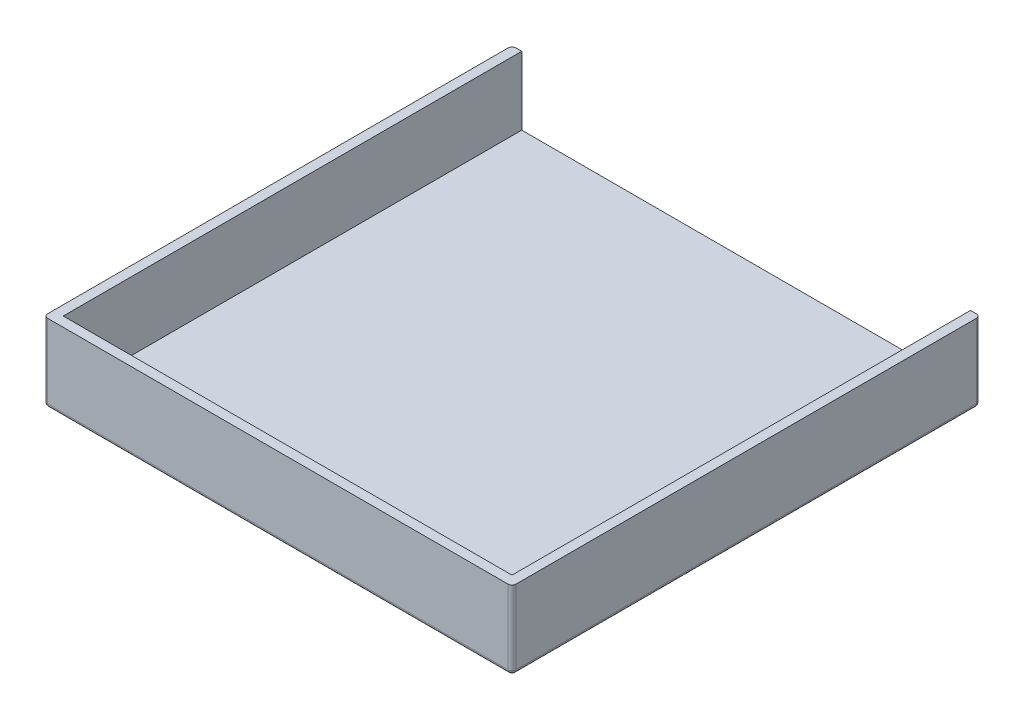
ISO-10303-21;
HEADER;
FILE_DESCRIPTION(('STEP AP214'),'2;1');
FILE_NAME('part.step','',(''),(''),'','','');
FILE_SCHEMA(('AUTOMOTIVE_DESIGN { 1 0 10303 214 1 1 1 1 }'));
ENDSEC;
DATA;
#1=APPLICATION_CONTEXT('core data for automotive mechanical design processes');
#2=APPLICATION_PROTOCOL_DEFINITION('international standard','automotive_design',2000,#1);
#3=PRODUCT_CONTEXT('',#1,'mechanical');
#4=PRODUCT('Part','Part','',(#3));
#5=PRODUCT_RELATED_PRODUCT_CATEGORY('part','',(#4));
#6=PRODUCT_DEFINITION_FORMATION('','',#4);
#7=PRODUCT_DEFINITION_CONTEXT('part definition',#1,'design');
#8=PRODUCT_DEFINITION('design','',#6,#7);
#9=PRODUCT_DEFINITION_SHAPE('','',#8);
#10=(LENGTH_UNIT() NAMED_UNIT(*) SI_UNIT(.MILLI.,.METRE.));
#11=(NAMED_UNIT(*) PLANE_ANGLE_UNIT() SI_UNIT($,.RADIAN.));
#12=(NAMED_UNIT(*) SI_UNIT($,.STERADIAN.) SOLID_ANGLE_UNIT());
#13=UNCERTAINTY_MEASURE_WITH_UNIT(LENGTH_MEASURE(1.E-05),#10,'distance_accuracy_value','');
#14=(GEOMETRIC_REPRESENTATION_CONTEXT(3) GLOBAL_UNCERTAINTY_ASSIGNED_CONTEXT((#13)) GLOBAL_UNIT_ASSIGNED_CONTEXT((#10,
#11,#12)) REPRESENTATION_CONTEXT('',''));
#15=CARTESIAN_POINT('',(0.,0.,0.));
#16=DIRECTION('',(0.,0.,1.));
#17=DIRECTION('',(1.,0.,0.));
#18=AXIS2_PLACEMENT_3D('',#15,#16,#17);
#19=CARTESIAN_POINT('',(0.,50.8,0.));
#20=DIRECTION('',(0.,-1.,0.));
#21=DIRECTION('',(0.,0.,-1.));
#22=AXIS2_PLACEMENT_3D('',#19,#20,#21);
#23=PLANE('',#22);
#24=DIRECTION('',(0.,0.,1.));
#25=VECTOR('',#24,1.);
#26=CARTESIAN_POINT('',(0.,50.8,0.));
#27=LINE('',#26,#25);
#28=CARTESIAN_POINT('',(0.,50.8,-302.26));
#29=VERTEX_POINT('',#28);
#30=CARTESIAN_POINT('',(0.,50.8,-2.54));
#31=VERTEX_POINT('',#30);
#32=EDGE_CURVE('E173',#29,#31,#27,.T.);
#33=ORIENTED_EDGE('',*,*,#32,.T.);
#34=CARTESIAN_POINT('',(2.54,50.8,-2.54));
#35=DIRECTION('',(0.,-1.,0.));
#36=DIRECTION('',(0.,0.,-1.));
#37=AXIS2_PLACEMENT_3D('',#34,#35,#36);
#38=CIRCLE('',#37,2.54);
#39=CARTESIAN_POINT('',(2.54,50.8,0.));
#40=VERTEX_POINT('',#39);
#41=EDGE_CURVE('E11',#31,#40,#38,.F.);
#42=ORIENTED_EDGE('',*,*,#41,.T.);
#43=DIRECTION('',(1.,0.,0.));
#44=VECTOR('',#43,1.);
#45=CARTESIAN_POINT('',(0.,50.8,0.));
#46=LINE('',#45,#44);
#47=CARTESIAN_POINT('',(302.26,50.8,0.));
#48=VERTEX_POINT('',#47);
#49=EDGE_CURVE('E176',#40,#48,#46,.T.);
#50=ORIENTED_EDGE('',*,*,#49,.T.);
#51=CARTESIAN_POINT('',(302.26,50.8,-2.54));
#52=DIRECTION('',(0.,-1.,0.));
#53=DIRECTION('',(0.,0.,-1.));
#54=AXIS2_PLACEMENT_3D('',#51,#52,#53);
#55=CIRCLE('',#54,2.54);
#56=CARTESIAN_POINT('',(304.8,50.8,-2.54));
#57=VERTEX_POINT('',#56);
#58=EDGE_CURVE('E42',#48,#57,#55,.F.);
#59=ORIENTED_EDGE('',*,*,#58,.T.);
#60=DIRECTION('',(0.,0.,-1.));
#61=VECTOR('',#60,1.);
#62=CARTESIAN_POINT('',(304.8,50.8,0.));
#63=LINE('',#62,#61);
#64=CARTESIAN_POINT('',(304.8,50.8,-302.26));
#65=VERTEX_POINT('',#64);
#66=EDGE_CURVE('E179',#57,#65,#63,.T.);
#67=ORIENTED_EDGE('',*,*,#66,.T.);
#68=CARTESIAN_POINT('',(302.26,50.8,-302.26));
#69=DIRECTION('',(0.,-1.,0.));
#70=DIRECTION('',(0.,0.,-1.));
#71=AXIS2_PLACEMENT_3D('',#68,#69,#70);
#72=CIRCLE('',#71,2.54);
#73=CARTESIAN_POINT('',(302.26,50.8,-304.8));
#74=VERTEX_POINT('',#73);
#75=EDGE_CURVE('E217',#65,#74,#72,.F.);
#76=ORIENTED_EDGE('',*,*,#75,.T.);
#77=DIRECTION('',(-1.,0.,0.));
#78=VECTOR('',#77,1.);
#79=CARTESIAN_POINT('',(0.,50.8,-304.8));
#80=LINE('',#79,#78);
#81=CARTESIAN_POINT('',(298.45,50.8,-304.8));
#82=VERTEX_POINT('',#81);
#83=EDGE_CURVE('E183',#74,#82,#80,.T.);
#84=ORIENTED_EDGE('',*,*,#83,.T.);
#85=DIRECTION('',(0.,0.,-1.));
#86=VECTOR('',#85,1.);
#87=CARTESIAN_POINT('',(298.45,50.8,0.));
#88=LINE('',#87,#86);
#89=CARTESIAN_POINT('',(298.45,50.8,-6.35));
#90=VERTEX_POINT('',#89);
#91=EDGE_CURVE('E167',#90,#82,#88,.T.);
#92=ORIENTED_EDGE('',*,*,#91,.F.);
#93=DIRECTION('',(1.,0.,0.));
#94=VECTOR('',#93,1.);
#95=CARTESIAN_POINT('',(0.,50.8,-6.35));
#96=LINE('',#95,#94);
#97=CARTESIAN_POINT('',(6.35,50.8,-6.35));
#98=VERTEX_POINT('',#97);
#99=EDGE_CURVE('E150',#98,#90,#96,.T.);
#100=ORIENTED_EDGE('',*,*,#99,.F.);
#101=DIRECTION('',(0.,0.,1.));
#102=VECTOR('',#101,1.);
#103=CARTESIAN_POINT('',(6.35,50.8,0.));
#104=LINE('',#103,#102);
#105=CARTESIAN_POINT('',(6.35,50.8,-304.8));
#106=VERTEX_POINT('',#105);
#107=EDGE_CURVE('E162',#106,#98,#104,.T.);
#108=ORIENTED_EDGE('',*,*,#107,.F.);
#109=CARTESIAN_POINT('',(2.54,50.8,-304.8));
#110=VERTEX_POINT('',#109);
#111=EDGE_CURVE('E182',#106,#110,#80,.T.);
#112=ORIENTED_EDGE('',*,*,#111,.T.);
#113=CARTESIAN_POINT('',(2.54,50.8,-302.26));
#114=DIRECTION('',(0.,-1.,0.));
#115=DIRECTION('',(0.,0.,-1.));
#116=AXIS2_PLACEMENT_3D('',#113,#114,#115);
#117=CIRCLE('',#116,2.54);
#118=EDGE_CURVE('E219',#110,#29,#117,.F.);
#119=ORIENTED_EDGE('',*,*,#118,.T.);
#120=EDGE_LOOP('',(#33,#42,#50,#59,#67,#76,#84,#92,#100,#108,#112,#119));
#121=FACE_BOUND('',#120,.T.);
#122=ADVANCED_FACE('F33',(#121),#23,.F.);
#123=CARTESIAN_POINT('',(0.,50.8,0.));
#124=DIRECTION('',(1.,0.,0.));
#125=DIRECTION('',(0.,0.,-1.));
#126=AXIS2_PLACEMENT_3D('',#123,#124,#125);
#127=PLANE('',#126);
#128=DIRECTION('',(0.,0.,1.));
#129=VECTOR('',#128,1.);
#130=CARTESIAN_POINT('',(0.,2.54,0.));
#131=LINE('',#130,#129);
#132=CARTESIAN_POINT('',(0.,2.54,-302.26));
#133=VERTEX_POINT('',#132);
#134=CARTESIAN_POINT('',(0.,2.54,-2.54));
#135=VERTEX_POINT('',#134);
#136=EDGE_CURVE('E50',#133,#135,#131,.T.);
#137=ORIENTED_EDGE('',*,*,#136,.T.);
#138=DIRECTION('',(0.,-1.,0.));
#139=VECTOR('',#138,1.);
#140=CARTESIAN_POINT('',(0.,50.8,-2.54));
#141=LINE('',#140,#139);
#142=EDGE_CURVE('E215',#135,#31,#141,.F.);
#143=ORIENTED_EDGE('',*,*,#142,.T.);
#144=ORIENTED_EDGE('',*,*,#32,.F.);
#145=DIRECTION('',(0.,-1.,0.));
#146=VECTOR('',#145,1.);
#147=CARTESIAN_POINT('',(0.,50.8,-302.26));
#148=LINE('',#147,#146);
#149=EDGE_CURVE('E55',#29,#133,#148,.T.);
#150=ORIENTED_EDGE('',*,*,#149,.T.);
#151=EDGE_LOOP('',(#137,#143,#144,#150));
#152=FACE_BOUND('',#151,.T.);
#153=ADVANCED_FACE('F284',(#152),#127,.F.);
#154=CARTESIAN_POINT('',(0.,50.8,0.));
#155=DIRECTION('',(0.,0.,-1.));
#156=DIRECTION('',(-1.,0.,0.));
#157=AXIS2_PLACEMENT_3D('',#154,#155,#156);
#158=PLANE('',#157);
#159=ORIENTED_EDGE('',*,*,#49,.F.);
#160=DIRECTION('',(0.,-1.,0.));
#161=VECTOR('',#160,1.);
#162=CARTESIAN_POINT('',(2.54,50.8,0.));
#163=LINE('',#162,#161);
#164=CARTESIAN_POINT('',(2.54,2.54,0.));
#165=VERTEX_POINT('',#164);
#166=EDGE_CURVE('E190',#40,#165,#163,.T.);
#167=ORIENTED_EDGE('',*,*,#166,.T.);
#168=DIRECTION('',(1.,0.,0.));
#169=VECTOR('',#168,1.);
#170=CARTESIAN_POINT('',(304.8,2.54,0.));
#171=LINE('',#170,#169);
#172=CARTESIAN_POINT('',(302.26,2.54,0.));
#173=VERTEX_POINT('',#172);
#174=EDGE_CURVE('E187',#165,#173,#171,.T.);
#175=ORIENTED_EDGE('',*,*,#174,.T.);
#176=DIRECTION('',(0.,-1.,0.));
#177=VECTOR('',#176,1.);
#178=CARTESIAN_POINT('',(302.26,50.8,0.));
#179=LINE('',#178,#177);
#180=EDGE_CURVE('E185',#173,#48,#179,.F.);
#181=ORIENTED_EDGE('',*,*,#180,.T.);
#182=EDGE_LOOP('',(#159,#167,#175,#181));
#183=FACE_BOUND('',#182,.T.);
#184=ADVANCED_FACE('F288',(#183),#158,.F.);
#185=CARTESIAN_POINT('',(304.8,50.8,0.));
#186=DIRECTION('',(-1.,0.,0.));
#187=DIRECTION('',(0.,0.,1.));
#188=AXIS2_PLACEMENT_3D('',#185,#186,#187);
#189=PLANE('',#188);
#190=ORIENTED_EDGE('',*,*,#66,.F.);
#191=DIRECTION('',(0.,-1.,0.));
#192=VECTOR('',#191,1.);
#193=CARTESIAN_POINT('',(304.8,50.8,-2.54));
#194=LINE('',#193,#192);
#195=CARTESIAN_POINT('',(304.8,2.54,-2.54));
#196=VERTEX_POINT('',#195);
#197=EDGE_CURVE('E205',#57,#196,#194,.T.);
#198=ORIENTED_EDGE('',*,*,#197,.T.);
#199=DIRECTION('',(0.,0.,-1.));
#200=VECTOR('',#199,1.);
#201=CARTESIAN_POINT('',(304.8,2.54,-304.8));
#202=LINE('',#201,#200);
#203=CARTESIAN_POINT('',(304.8,2.54,-302.26));
#204=VERTEX_POINT('',#203);
#205=EDGE_CURVE('E203',#196,#204,#202,.T.);
#206=ORIENTED_EDGE('',*,*,#205,.T.);
#207=DIRECTION('',(0.,-1.,0.));
#208=VECTOR('',#207,1.);
#209=CARTESIAN_POINT('',(304.8,50.8,-302.26));
#210=LINE('',#209,#208);
#211=EDGE_CURVE('E201',#204,#65,#210,.F.);
#212=ORIENTED_EDGE('',*,*,#211,.T.);
#213=EDGE_LOOP('',(#190,#198,#206,#212));
#214=FACE_BOUND('',#213,.T.);
#215=ADVANCED_FACE('F297',(#214),#189,.F.);
#216=CARTESIAN_POINT('',(0.,50.8,-304.8));
#217=DIRECTION('',(0.,0.,1.));
#218=DIRECTION('',(1.,0.,0.));
#219=AXIS2_PLACEMENT_3D('',#216,#217,#218);
#220=PLANE('',#219);
#221=DIRECTION('',(-1.,0.,0.));
#222=VECTOR('',#221,1.);
#223=CARTESIAN_POINT('',(0.,2.54,-304.8));
#224=LINE('',#223,#222);
#225=CARTESIAN_POINT('',(302.26,2.54,-304.8));
#226=VERTEX_POINT('',#225);
#227=CARTESIAN_POINT('',(2.54,2.54,-304.8));
#228=VERTEX_POINT('',#227);
#229=EDGE_CURVE('E209',#226,#228,#224,.T.);
#230=ORIENTED_EDGE('',*,*,#229,.T.);
#231=DIRECTION('',(0.,-1.,0.));
#232=VECTOR('',#231,1.);
#233=CARTESIAN_POINT('',(2.54,50.8,-304.8));
#234=LINE('',#233,#232);
#235=EDGE_CURVE('E211',#228,#110,#234,.F.);
#236=ORIENTED_EDGE('',*,*,#235,.T.);
#237=ORIENTED_EDGE('',*,*,#111,.F.);
#238=DIRECTION('',(0.,-1.,0.));
#239=VECTOR('',#238,1.);
#240=CARTESIAN_POINT('',(6.35,50.8,-304.8));
#241=LINE('',#240,#239);
#242=CARTESIAN_POINT('',(6.35,6.35,-304.8));
#243=VERTEX_POINT('',#242);
#244=EDGE_CURVE('E169',#106,#243,#241,.T.);
#245=ORIENTED_EDGE('',*,*,#244,.T.);
#246=DIRECTION('',(-1.,0.,0.));
#247=VECTOR('',#246,1.);
#248=CARTESIAN_POINT('',(0.,6.35,-304.8));
#249=LINE('',#248,#247);
#250=CARTESIAN_POINT('',(298.45,6.35,-304.8));
#251=VERTEX_POINT('',#250);
#252=EDGE_CURVE('E160',#251,#243,#249,.T.);
#253=ORIENTED_EDGE('',*,*,#252,.F.);
#254=DIRECTION('',(0.,-1.,0.));
#255=VECTOR('',#254,1.);
#256=CARTESIAN_POINT('',(298.45,50.8,-304.8));
#257=LINE('',#256,#255);
#258=EDGE_CURVE('E155',#82,#251,#257,.T.);
#259=ORIENTED_EDGE('',*,*,#258,.F.);
#260=ORIENTED_EDGE('',*,*,#83,.F.);
#261=DIRECTION('',(0.,-1.,0.));
#262=VECTOR('',#261,1.);
#263=CARTESIAN_POINT('',(302.26,50.8,-304.8));
#264=LINE('',#263,#262);
#265=EDGE_CURVE('E207',#74,#226,#264,.T.);
#266=ORIENTED_EDGE('',*,*,#265,.T.);
#267=EDGE_LOOP('',(#230,#236,#237,#245,#253,#259,#260,#266));
#268=FACE_BOUND('',#267,.T.);
#269=ADVANCED_FACE('F265',(#268),#220,.F.);
#270=CARTESIAN_POINT('',(0.,0.,0.));
#271=DIRECTION('',(0.,-1.,0.));
#272=DIRECTION('',(0.,0.,-1.));
#273=AXIS2_PLACEMENT_3D('',#270,#271,#272);
#274=PLANE('',#273);
#275=DIRECTION('',(0.,0.,-1.));
#276=VECTOR('',#275,1.);
#277=CARTESIAN_POINT('',(302.26,0.,0.));
#278=LINE('',#277,#276);
#279=CARTESIAN_POINT('',(302.26,0.,-302.26));
#280=VERTEX_POINT('',#279);
#281=CARTESIAN_POINT('',(302.26,0.,-2.54));
#282=VERTEX_POINT('',#281);
#283=EDGE_CURVE('E196',#280,#282,#278,.F.);
#284=ORIENTED_EDGE('',*,*,#283,.T.);
#285=DIRECTION('',(1.,0.,0.));
#286=VECTOR('',#285,1.);
#287=CARTESIAN_POINT('',(0.,0.,-2.54));
#288=LINE('',#287,#286);
#289=CARTESIAN_POINT('',(2.54,0.,-2.54));
#290=VERTEX_POINT('',#289);
#291=EDGE_CURVE('E198',#282,#290,#288,.F.);
#292=ORIENTED_EDGE('',*,*,#291,.T.);
#293=DIRECTION('',(0.,0.,1.));
#294=VECTOR('',#293,1.);
#295=CARTESIAN_POINT('',(2.54,0.,-304.8));
#296=LINE('',#295,#294);
#297=CARTESIAN_POINT('',(2.54,0.,-302.26));
#298=VERTEX_POINT('',#297);
#299=EDGE_CURVE('E192',#290,#298,#296,.F.);
#300=ORIENTED_EDGE('',*,*,#299,.T.);
#301=DIRECTION('',(-1.,0.,0.));
#302=VECTOR('',#301,1.);
#303=CARTESIAN_POINT('',(304.8,0.,-302.26));
#304=LINE('',#303,#302);
#305=EDGE_CURVE('E194',#298,#280,#304,.F.);
#306=ORIENTED_EDGE('',*,*,#305,.T.);
#307=EDGE_LOOP('',(#284,#292,#300,#306));
#308=FACE_BOUND('',#307,.T.);
#309=ADVANCED_FACE('F313',(#308),#274,.T.);
#310=CARTESIAN_POINT('',(6.35,50.8,0.));
#311=DIRECTION('',(1.,0.,0.));
#312=DIRECTION('',(0.,0.,-1.));
#313=AXIS2_PLACEMENT_3D('',#310,#311,#312);
#314=PLANE('',#313);
#315=DIRECTION('',(0.,0.,1.));
#316=VECTOR('',#315,1.);
#317=CARTESIAN_POINT('',(6.35,6.35,0.));
#318=LINE('',#317,#316);
#319=CARTESIAN_POINT('',(6.35,6.35,-6.35));
#320=VERTEX_POINT('',#319);
#321=EDGE_CURVE('E141',#243,#320,#318,.T.);
#322=ORIENTED_EDGE('',*,*,#321,.F.);
#323=ORIENTED_EDGE('',*,*,#244,.F.);
#324=ORIENTED_EDGE('',*,*,#107,.T.);
#325=DIRECTION('',(0.,-1.,0.));
#326=VECTOR('',#325,1.);
#327=CARTESIAN_POINT('',(6.35,50.8,-6.35));
#328=LINE('',#327,#326);
#329=EDGE_CURVE('E154',#98,#320,#328,.T.);
#330=ORIENTED_EDGE('',*,*,#329,.T.);
#331=EDGE_LOOP('',(#322,#323,#324,#330));
#332=FACE_BOUND('',#331,.T.);
#333=ADVANCED_FACE('F258',(#332),#314,.T.);
#334=CARTESIAN_POINT('',(0.,50.8,-6.35));
#335=DIRECTION('',(0.,0.,-1.));
#336=DIRECTION('',(-1.,0.,0.));
#337=AXIS2_PLACEMENT_3D('',#334,#335,#336);
#338=PLANE('',#337);
#339=DIRECTION('',(1.,0.,0.));
#340=VECTOR('',#339,1.);
#341=CARTESIAN_POINT('',(0.,6.35,-6.35));
#342=LINE('',#341,#340);
#343=CARTESIAN_POINT('',(298.45,6.35,-6.35));
#344=VERTEX_POINT('',#343);
#345=EDGE_CURVE('E134',#320,#344,#342,.T.);
#346=ORIENTED_EDGE('',*,*,#345,.F.);
#347=ORIENTED_EDGE('',*,*,#329,.F.);
#348=ORIENTED_EDGE('',*,*,#99,.T.);
#349=DIRECTION('',(0.,-1.,0.));
#350=VECTOR('',#349,1.);
#351=CARTESIAN_POINT('',(298.45,50.8,-6.35));
#352=LINE('',#351,#350);
#353=EDGE_CURVE('E147',#90,#344,#352,.T.);
#354=ORIENTED_EDGE('',*,*,#353,.T.);
#355=EDGE_LOOP('',(#346,#347,#348,#354));
#356=FACE_BOUND('',#355,.T.);
#357=ADVANCED_FACE('F148',(#356),#338,.T.);
#358=CARTESIAN_POINT('',(298.45,50.8,0.));
#359=DIRECTION('',(-1.,0.,0.));
#360=DIRECTION('',(0.,0.,1.));
#361=AXIS2_PLACEMENT_3D('',#358,#359,#360);
#362=PLANE('',#361);
#363=DIRECTION('',(0.,0.,-1.));
#364=VECTOR('',#363,1.);
#365=CARTESIAN_POINT('',(298.45,6.35,0.));
#366=LINE('',#365,#364);
#367=EDGE_CURVE('E138',#344,#251,#366,.T.);
#368=ORIENTED_EDGE('',*,*,#367,.F.);
#369=ORIENTED_EDGE('',*,*,#353,.F.);
#370=ORIENTED_EDGE('',*,*,#91,.T.);
#371=ORIENTED_EDGE('',*,*,#258,.T.);
#372=EDGE_LOOP('',(#368,#369,#370,#371));
#373=FACE_BOUND('',#372,.T.);
#374=ADVANCED_FACE('F157',(#373),#362,.T.);
#375=CARTESIAN_POINT('',(0.,6.35,0.));
#376=DIRECTION('',(0.,-1.,0.));
#377=DIRECTION('',(0.,0.,-1.));
#378=AXIS2_PLACEMENT_3D('',#375,#376,#377);
#379=PLANE('',#378);
#380=ORIENTED_EDGE('',*,*,#321,.T.);
#381=ORIENTED_EDGE('',*,*,#345,.T.);
#382=ORIENTED_EDGE('',*,*,#367,.T.);
#383=ORIENTED_EDGE('',*,*,#252,.T.);
#384=EDGE_LOOP('',(#380,#381,#382,#383));
#385=FACE_BOUND('',#384,.T.);
#386=ADVANCED_FACE('F136',(#385),#379,.F.);
#387=CARTESIAN_POINT('',(2.54,50.8,-302.26));
#388=DIRECTION('',(0.,-1.,0.));
#389=DIRECTION('',(0.,0.,-1.));
#390=AXIS2_PLACEMENT_3D('',#387,#388,#389);
#391=CYLINDRICAL_SURFACE('',#390,2.54);
#392=ORIENTED_EDGE('',*,*,#118,.F.);
#393=ORIENTED_EDGE('',*,*,#235,.F.);
#394=CARTESIAN_POINT('',(2.54,2.54,-302.26));
#395=DIRECTION('',(0.,-1.,0.));
#396=DIRECTION('',(0.,0.,-1.));
#397=AXIS2_PLACEMENT_3D('',#394,#395,#396);
#398=CIRCLE('',#397,2.54);
#399=EDGE_CURVE('E249',#133,#228,#398,.T.);
#400=ORIENTED_EDGE('',*,*,#399,.F.);
#401=ORIENTED_EDGE('',*,*,#149,.F.);
#402=EDGE_LOOP('',(#392,#393,#400,#401));
#403=FACE_BOUND('',#402,.T.);
#404=ADVANCED_FACE('F35',(#403),#391,.T.);
#405=CARTESIAN_POINT('',(302.26,50.8,-302.26));
#406=DIRECTION('',(0.,-1.,0.));
#407=DIRECTION('',(0.,0.,-1.));
#408=AXIS2_PLACEMENT_3D('',#405,#406,#407);
#409=CYLINDRICAL_SURFACE('',#408,2.54);
#410=ORIENTED_EDGE('',*,*,#75,.F.);
#411=ORIENTED_EDGE('',*,*,#211,.F.);
#412=CARTESIAN_POINT('',(302.26,2.54,-302.26));
#413=DIRECTION('',(0.,-1.,0.));
#414=DIRECTION('',(0.,0.,-1.));
#415=AXIS2_PLACEMENT_3D('',#412,#413,#414);
#416=CIRCLE('',#415,2.54);
#417=EDGE_CURVE('E247',#226,#204,#416,.T.);
#418=ORIENTED_EDGE('',*,*,#417,.F.);
#419=ORIENTED_EDGE('',*,*,#265,.F.);
#420=EDGE_LOOP('',(#410,#411,#418,#419));
#421=FACE_BOUND('',#420,.T.);
#422=ADVANCED_FACE('F302',(#421),#409,.T.);
#423=CARTESIAN_POINT('',(0.,2.54,-302.26));
#424=DIRECTION('',(1.,0.,0.));
#425=DIRECTION('',(0.,0.,-1.));
#426=AXIS2_PLACEMENT_3D('',#423,#424,#425);
#427=CYLINDRICAL_SURFACE('',#426,2.54);
#428=CARTESIAN_POINT('',(2.54,2.54,-302.26));
#429=DIRECTION('',(-1.,0.,0.));
#430=DIRECTION('',(0.,0.,1.));
#431=AXIS2_PLACEMENT_3D('',#428,#429,#430);
#432=CIRCLE('',#431,2.54);
#433=EDGE_CURVE('E37',#228,#298,#432,.T.);
#434=ORIENTED_EDGE('',*,*,#433,.F.);
#435=ORIENTED_EDGE('',*,*,#229,.F.);
#436=CARTESIAN_POINT('',(302.26,2.54,-302.26));
#437=DIRECTION('',(1.,0.,0.));
#438=DIRECTION('',(0.,0.,-1.));
#439=AXIS2_PLACEMENT_3D('',#436,#437,#438);
#440=CIRCLE('',#439,2.54);
#441=EDGE_CURVE('E244',#280,#226,#440,.T.);
#442=ORIENTED_EDGE('',*,*,#441,.F.);
#443=ORIENTED_EDGE('',*,*,#305,.F.);
#444=EDGE_LOOP('',(#434,#435,#442,#443));
#445=FACE_BOUND('',#444,.T.);
#446=ADVANCED_FACE('F317',(#445),#427,.T.);
#447=CARTESIAN_POINT('',(2.54,2.54,-302.26));
#448=DIRECTION('',(0.,0.,1.));
#449=DIRECTION('',(1.,0.,0.));
#450=AXIS2_PLACEMENT_3D('',#447,#448,#449);
#451=SPHERICAL_SURFACE('',#450,2.54);
#452=ORIENTED_EDGE('',*,*,#399,.T.);
#453=ORIENTED_EDGE('',*,*,#433,.T.);
#454=CARTESIAN_POINT('',(2.54,2.54,-302.26));
#455=DIRECTION('',(0.,0.,-1.));
#456=DIRECTION('',(-1.,0.,0.));
#457=AXIS2_PLACEMENT_3D('',#454,#455,#456);
#458=CIRCLE('',#457,2.54);
#459=EDGE_CURVE('E241',#133,#298,#458,.F.);
#460=ORIENTED_EDGE('',*,*,#459,.F.);
#461=EDGE_LOOP('',(#452,#453,#460));
#462=FACE_BOUND('',#461,.T.);
#463=ADVANCED_FACE('F270',(#462),#451,.T.);
#464=CARTESIAN_POINT('',(302.26,2.54,-302.26));
#465=DIRECTION('',(0.,0.,1.));
#466=DIRECTION('',(1.,0.,0.));
#467=AXIS2_PLACEMENT_3D('',#464,#465,#466);
#468=SPHERICAL_SURFACE('',#467,2.54);
#469=ORIENTED_EDGE('',*,*,#441,.T.);
#470=ORIENTED_EDGE('',*,*,#417,.T.);
#471=CARTESIAN_POINT('',(302.26,2.54,-302.26));
#472=DIRECTION('',(0.,0.,-1.));
#473=DIRECTION('',(-1.,0.,0.));
#474=AXIS2_PLACEMENT_3D('',#471,#472,#473);
#475=CIRCLE('',#474,2.54);
#476=EDGE_CURVE('E238',#280,#204,#475,.F.);
#477=ORIENTED_EDGE('',*,*,#476,.F.);
#478=EDGE_LOOP('',(#469,#470,#477));
#479=FACE_BOUND('',#478,.T.);
#480=ADVANCED_FACE('F305',(#479),#468,.T.);
#481=CARTESIAN_POINT('',(2.54,2.54,0.));
#482=DIRECTION('',(0.,0.,-1.));
#483=DIRECTION('',(-1.,0.,0.));
#484=AXIS2_PLACEMENT_3D('',#481,#482,#483);
#485=CYLINDRICAL_SURFACE('',#484,2.54);
#486=ORIENTED_EDGE('',*,*,#459,.T.);
#487=ORIENTED_EDGE('',*,*,#299,.F.);
#488=CARTESIAN_POINT('',(2.54,2.54,-2.54));
#489=DIRECTION('',(0.,0.,1.));
#490=DIRECTION('',(1.,0.,0.));
#491=AXIS2_PLACEMENT_3D('',#488,#489,#490);
#492=CIRCLE('',#491,2.54);
#493=EDGE_CURVE('E235',#135,#290,#492,.T.);
#494=ORIENTED_EDGE('',*,*,#493,.F.);
#495=ORIENTED_EDGE('',*,*,#136,.F.);
#496=EDGE_LOOP('',(#486,#487,#494,#495));
#497=FACE_BOUND('',#496,.T.);
#498=ADVANCED_FACE('F274',(#497),#485,.T.);
#499=CARTESIAN_POINT('',(2.54,50.8,-2.54));
#500=DIRECTION('',(0.,-1.,0.));
#501=DIRECTION('',(0.,0.,-1.));
#502=AXIS2_PLACEMENT_3D('',#499,#500,#501);
#503=CYLINDRICAL_SURFACE('',#502,2.54);
#504=ORIENTED_EDGE('',*,*,#41,.F.);
#505=ORIENTED_EDGE('',*,*,#142,.F.);
#506=CARTESIAN_POINT('',(2.54,2.54,-2.54));
#507=DIRECTION('',(0.,-1.,0.));
#508=DIRECTION('',(0.,0.,-1.));
#509=AXIS2_PLACEMENT_3D('',#506,#507,#508);
#510=CIRCLE('',#509,2.54);
#511=EDGE_CURVE('E232',#165,#135,#510,.T.);
#512=ORIENTED_EDGE('',*,*,#511,.F.);
#513=ORIENTED_EDGE('',*,*,#166,.F.);
#514=EDGE_LOOP('',(#504,#505,#512,#513));
#515=FACE_BOUND('',#514,.T.);
#516=ADVANCED_FACE('F283',(#515),#503,.T.);
#517=CARTESIAN_POINT('',(302.26,50.8,-2.54));
#518=DIRECTION('',(0.,-1.,0.));
#519=DIRECTION('',(0.,0.,-1.));
#520=AXIS2_PLACEMENT_3D('',#517,#518,#519);
#521=CYLINDRICAL_SURFACE('',#520,2.54);
#522=ORIENTED_EDGE('',*,*,#58,.F.);
#523=ORIENTED_EDGE('',*,*,#180,.F.);
#524=CARTESIAN_POINT('',(302.26,2.54,-2.54));
#525=DIRECTION('',(0.,-1.,0.));
#526=DIRECTION('',(0.,0.,-1.));
#527=AXIS2_PLACEMENT_3D('',#524,#525,#526);
#528=CIRCLE('',#527,2.54);
#529=EDGE_CURVE('E229',#196,#173,#528,.T.);
#530=ORIENTED_EDGE('',*,*,#529,.F.);
#531=ORIENTED_EDGE('',*,*,#197,.F.);
#532=EDGE_LOOP('',(#522,#523,#530,#531));
#533=FACE_BOUND('',#532,.T.);
#534=ADVANCED_FACE('F292',(#533),#521,.T.);
#535=CARTESIAN_POINT('',(302.26,2.54,0.));
#536=DIRECTION('',(0.,0.,1.));
#537=DIRECTION('',(1.,0.,0.));
#538=AXIS2_PLACEMENT_3D('',#535,#536,#537);
#539=CYLINDRICAL_SURFACE('',#538,2.54);
#540=ORIENTED_EDGE('',*,*,#476,.T.);
#541=ORIENTED_EDGE('',*,*,#205,.F.);
#542=CARTESIAN_POINT('',(302.26,2.54,-2.54));
#543=DIRECTION('',(0.,0.,1.));
#544=DIRECTION('',(1.,0.,0.));
#545=AXIS2_PLACEMENT_3D('',#542,#543,#544);
#546=CIRCLE('',#545,2.54);
#547=EDGE_CURVE('E226',#282,#196,#546,.T.);
#548=ORIENTED_EDGE('',*,*,#547,.F.);
#549=ORIENTED_EDGE('',*,*,#283,.F.);
#550=EDGE_LOOP('',(#540,#541,#548,#549));
#551=FACE_BOUND('',#550,.T.);
#552=ADVANCED_FACE('F309',(#551),#539,.T.);
#553=CARTESIAN_POINT('',(2.54,2.54,-2.54));
#554=DIRECTION('',(0.,0.,1.));
#555=DIRECTION('',(1.,0.,0.));
#556=AXIS2_PLACEMENT_3D('',#553,#554,#555);
#557=SPHERICAL_SURFACE('',#556,2.54);
#558=ORIENTED_EDGE('',*,*,#511,.T.);
#559=ORIENTED_EDGE('',*,*,#493,.T.);
#560=CARTESIAN_POINT('',(2.54,2.54,-2.54));
#561=DIRECTION('',(-1.,0.,0.));
#562=DIRECTION('',(0.,0.,1.));
#563=AXIS2_PLACEMENT_3D('',#560,#561,#562);
#564=CIRCLE('',#563,2.54);
#565=EDGE_CURVE('E224',#165,#290,#564,.F.);
#566=ORIENTED_EDGE('',*,*,#565,.F.);
#567=EDGE_LOOP('',(#558,#559,#566));
#568=FACE_BOUND('',#567,.T.);
#569=ADVANCED_FACE('F278',(#568),#557,.T.);
#570=CARTESIAN_POINT('',(302.26,2.54,-2.54));
#571=DIRECTION('',(0.,0.,1.));
#572=DIRECTION('',(1.,0.,0.));
#573=AXIS2_PLACEMENT_3D('',#570,#571,#572);
#574=SPHERICAL_SURFACE('',#573,2.54);
#575=ORIENTED_EDGE('',*,*,#547,.T.);
#576=ORIENTED_EDGE('',*,*,#529,.T.);
#577=CARTESIAN_POINT('',(302.26,2.54,-2.54));
#578=DIRECTION('',(1.,0.,0.));
#579=DIRECTION('',(0.,0.,-1.));
#580=AXIS2_PLACEMENT_3D('',#577,#578,#579);
#581=CIRCLE('',#580,2.54);
#582=EDGE_CURVE('E222',#282,#173,#581,.F.);
#583=ORIENTED_EDGE('',*,*,#582,.F.);
#584=EDGE_LOOP('',(#575,#576,#583));
#585=FACE_BOUND('',#584,.T.);
#586=ADVANCED_FACE('F345',(#585),#574,.T.);
#587=CARTESIAN_POINT('',(0.,2.54,-2.54));
#588=DIRECTION('',(-1.,0.,0.));
#589=DIRECTION('',(0.,0.,1.));
#590=AXIS2_PLACEMENT_3D('',#587,#588,#589);
#591=CYLINDRICAL_SURFACE('',#590,2.54);
#592=ORIENTED_EDGE('',*,*,#565,.T.);
#593=ORIENTED_EDGE('',*,*,#291,.F.);
#594=ORIENTED_EDGE('',*,*,#582,.T.);
#595=ORIENTED_EDGE('',*,*,#174,.F.);
#596=EDGE_LOOP('',(#592,#593,#594,#595));
#597=FACE_BOUND('',#596,.T.);
#598=ADVANCED_FACE('F342',(#597),#591,.T.);
#599=CLOSED_SHELL('',(#122,#153,#184,#215,#269,#309,#333,#357,#374,#386,#404,#422,#446,#463,
#480,#498,#516,#534,#552,#569,#586,#598));
#600=MANIFOLD_SOLID_BREP('B2',#599);
#601=ADVANCED_BREP_SHAPE_REPRESENTATION('',(#18,#600),#14);
#602=SHAPE_DEFINITION_REPRESENTATION(#9,#601);
ENDSEC;
END-ISO-10303-21;
